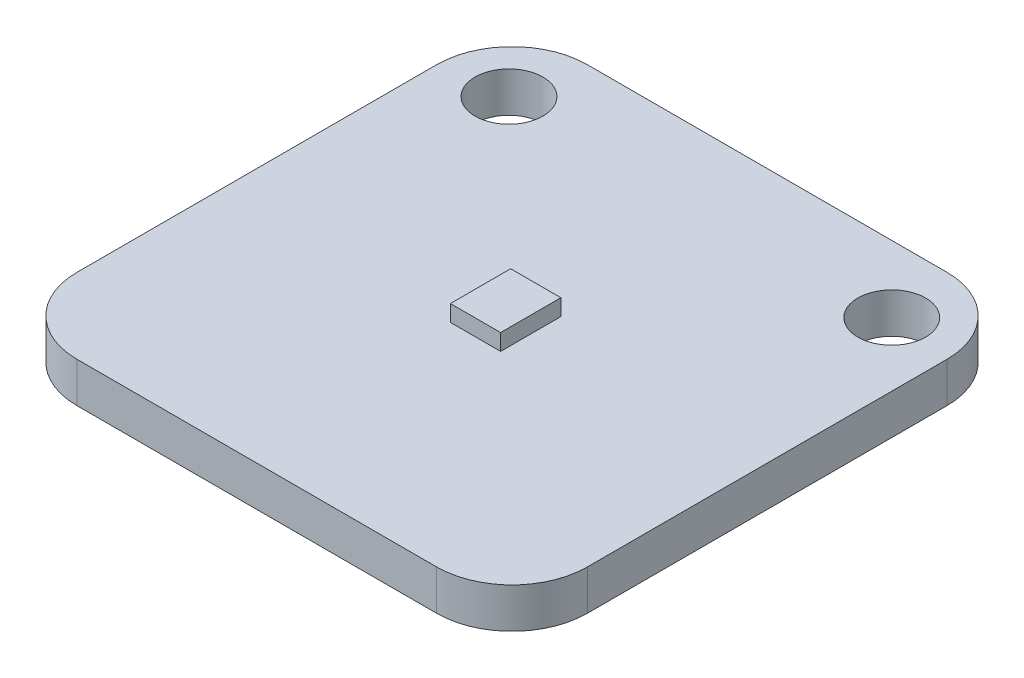
ISO-10303-21;
HEADER;
FILE_DESCRIPTION(('STEP AP214'),'2;1');
FILE_NAME('part.step','',(''),(''),'','','');
FILE_SCHEMA(('AUTOMOTIVE_DESIGN { 1 0 10303 214 1 1 1 1 }'));
ENDSEC;
DATA;
#1=APPLICATION_CONTEXT('core data for automotive mechanical design processes');
#2=APPLICATION_PROTOCOL_DEFINITION('international standard','automotive_design',2000,#1);
#3=PRODUCT_CONTEXT('',#1,'mechanical');
#4=PRODUCT('Part','Part','',(#3));
#5=PRODUCT_RELATED_PRODUCT_CATEGORY('part','',(#4));
#6=PRODUCT_DEFINITION_FORMATION('','',#4);
#7=PRODUCT_DEFINITION_CONTEXT('part definition',#1,'design');
#8=PRODUCT_DEFINITION('design','',#6,#7);
#9=PRODUCT_DEFINITION_SHAPE('','',#8);
#10=(LENGTH_UNIT() NAMED_UNIT(*) SI_UNIT(.MILLI.,.METRE.));
#11=(NAMED_UNIT(*) PLANE_ANGLE_UNIT() SI_UNIT($,.RADIAN.));
#12=(NAMED_UNIT(*) SI_UNIT($,.STERADIAN.) SOLID_ANGLE_UNIT());
#13=UNCERTAINTY_MEASURE_WITH_UNIT(LENGTH_MEASURE(1.E-05),#10,'distance_accuracy_value','');
#14=(GEOMETRIC_REPRESENTATION_CONTEXT(3) GLOBAL_UNCERTAINTY_ASSIGNED_CONTEXT((#13)) GLOBAL_UNIT_ASSIGNED_CONTEXT((#10,
#11,#12)) REPRESENTATION_CONTEXT('',''));
#15=CARTESIAN_POINT('',(0.,0.,0.));
#16=DIRECTION('',(0.,0.,1.));
#17=DIRECTION('',(1.,0.,0.));
#18=AXIS2_PLACEMENT_3D('',#15,#16,#17);
#19=CARTESIAN_POINT('',(0.999999999999998,2.25,-0.945999999999999));
#20=DIRECTION('',(-1.,0.,0.));
#21=DIRECTION('',(0.,0.,1.));
#22=AXIS2_PLACEMENT_3D('',#19,#20,#21);
#23=PLANE('',#22);
#24=DIRECTION('',(0.,0.,-1.));
#25=VECTOR('',#24,1.);
#26=CARTESIAN_POINT('',(0.999999999999998,1.6,-0.945999999999999));
#27=LINE('',#26,#25);
#28=CARTESIAN_POINT('',(0.999999999999999,1.6,1.454));
#29=VERTEX_POINT('',#28);
#30=CARTESIAN_POINT('',(0.999999999999998,1.6,-0.945999999999999));
#31=VERTEX_POINT('',#30);
#32=EDGE_CURVE('E127',#29,#31,#27,.T.);
#33=ORIENTED_EDGE('',*,*,#32,.T.);
#34=DIRECTION('',(0.,-1.,0.));
#35=VECTOR('',#34,1.);
#36=CARTESIAN_POINT('',(0.999999999999998,2.25,-0.945999999999999));
#37=LINE('',#36,#35);
#38=CARTESIAN_POINT('',(0.999999999999998,2.25,-0.945999999999999));
#39=VERTEX_POINT('',#38);
#40=EDGE_CURVE('E12',#39,#31,#37,.T.);
#41=ORIENTED_EDGE('',*,*,#40,.F.);
#42=DIRECTION('',(0.,0.,-1.));
#43=VECTOR('',#42,1.);
#44=CARTESIAN_POINT('',(0.999999999999998,2.25,-0.945999999999999));
#45=LINE('',#44,#43);
#46=CARTESIAN_POINT('',(0.999999999999999,2.25,1.454));
#47=VERTEX_POINT('',#46);
#48=EDGE_CURVE('E108',#47,#39,#45,.T.);
#49=ORIENTED_EDGE('',*,*,#48,.F.);
#50=DIRECTION('',(0.,-1.,0.));
#51=VECTOR('',#50,1.);
#52=CARTESIAN_POINT('',(0.999999999999999,2.25,1.454));
#53=LINE('',#52,#51);
#54=EDGE_CURVE('E125',#47,#29,#53,.T.);
#55=ORIENTED_EDGE('',*,*,#54,.T.);
#56=EDGE_LOOP('',(#33,#41,#49,#55));
#57=FACE_BOUND('',#56,.T.);
#58=ADVANCED_FACE('F60',(#57),#23,.F.);
#59=CARTESIAN_POINT('',(-1.,2.25,-0.945999999999999));
#60=DIRECTION('',(0.,0.,1.));
#61=DIRECTION('',(1.,0.,0.));
#62=AXIS2_PLACEMENT_3D('',#59,#60,#61);
#63=PLANE('',#62);
#64=DIRECTION('',(-1.,0.,0.));
#65=VECTOR('',#64,1.);
#66=CARTESIAN_POINT('',(-1.,1.6,-0.945999999999999));
#67=LINE('',#66,#65);
#68=CARTESIAN_POINT('',(-1.,1.6,-0.945999999999999));
#69=VERTEX_POINT('',#68);
#70=EDGE_CURVE('E111',#31,#69,#67,.T.);
#71=ORIENTED_EDGE('',*,*,#70,.T.);
#72=DIRECTION('',(0.,-1.,0.));
#73=VECTOR('',#72,1.);
#74=CARTESIAN_POINT('',(-1.,2.25,-0.945999999999999));
#75=LINE('',#74,#73);
#76=CARTESIAN_POINT('',(-1.,2.25,-0.945999999999999));
#77=VERTEX_POINT('',#76);
#78=EDGE_CURVE('E67',#77,#69,#75,.T.);
#79=ORIENTED_EDGE('',*,*,#78,.F.);
#80=DIRECTION('',(-1.,0.,0.));
#81=VECTOR('',#80,1.);
#82=CARTESIAN_POINT('',(-1.,2.25,-0.945999999999999));
#83=LINE('',#82,#81);
#84=EDGE_CURVE('E102',#39,#77,#83,.T.);
#85=ORIENTED_EDGE('',*,*,#84,.F.);
#86=ORIENTED_EDGE('',*,*,#40,.T.);
#87=EDGE_LOOP('',(#71,#79,#85,#86));
#88=FACE_BOUND('',#87,.T.);
#89=ADVANCED_FACE('F114',(#88),#63,.F.);
#90=CARTESIAN_POINT('',(-1.,2.25,-0.945999999999999));
#91=DIRECTION('',(1.,0.,0.));
#92=DIRECTION('',(0.,0.,-1.));
#93=AXIS2_PLACEMENT_3D('',#90,#91,#92);
#94=PLANE('',#93);
#95=DIRECTION('',(0.,0.,1.));
#96=VECTOR('',#95,1.);
#97=CARTESIAN_POINT('',(-1.,1.6,-0.945999999999999));
#98=LINE('',#97,#96);
#99=CARTESIAN_POINT('',(-1.,1.6,1.454));
#100=VERTEX_POINT('',#99);
#101=EDGE_CURVE('E93',#69,#100,#98,.T.);
#102=ORIENTED_EDGE('',*,*,#101,.T.);
#103=DIRECTION('',(0.,-1.,0.));
#104=VECTOR('',#103,1.);
#105=CARTESIAN_POINT('',(-1.,2.25,1.454));
#106=LINE('',#105,#104);
#107=CARTESIAN_POINT('',(-1.,2.25,1.454));
#108=VERTEX_POINT('',#107);
#109=EDGE_CURVE('E116',#108,#100,#106,.T.);
#110=ORIENTED_EDGE('',*,*,#109,.F.);
#111=DIRECTION('',(0.,0.,1.));
#112=VECTOR('',#111,1.);
#113=CARTESIAN_POINT('',(-1.,2.25,-0.945999999999999));
#114=LINE('',#113,#112);
#115=EDGE_CURVE('E110',#77,#108,#114,.T.);
#116=ORIENTED_EDGE('',*,*,#115,.F.);
#117=ORIENTED_EDGE('',*,*,#78,.T.);
#118=EDGE_LOOP('',(#102,#110,#116,#117));
#119=FACE_BOUND('',#118,.T.);
#120=ADVANCED_FACE('F120',(#119),#94,.F.);
#121=CARTESIAN_POINT('',(-1.,2.25,1.454));
#122=DIRECTION('',(0.,0.,-1.));
#123=DIRECTION('',(-1.,0.,0.));
#124=AXIS2_PLACEMENT_3D('',#121,#122,#123);
#125=PLANE('',#124);
#126=DIRECTION('',(1.,0.,0.));
#127=VECTOR('',#126,1.);
#128=CARTESIAN_POINT('',(-1.,1.6,1.454));
#129=LINE('',#128,#127);
#130=EDGE_CURVE('E100',#100,#29,#129,.T.);
#131=ORIENTED_EDGE('',*,*,#130,.T.);
#132=ORIENTED_EDGE('',*,*,#54,.F.);
#133=DIRECTION('',(1.,0.,0.));
#134=VECTOR('',#133,1.);
#135=CARTESIAN_POINT('',(-1.,2.25,1.454));
#136=LINE('',#135,#134);
#137=EDGE_CURVE('E74',#108,#47,#136,.T.);
#138=ORIENTED_EDGE('',*,*,#137,.F.);
#139=ORIENTED_EDGE('',*,*,#109,.T.);
#140=EDGE_LOOP('',(#131,#132,#138,#139));
#141=FACE_BOUND('',#140,.T.);
#142=ADVANCED_FACE('F138',(#141),#125,.F.);
#143=CARTESIAN_POINT('',(0.,2.25,0.));
#144=DIRECTION('',(0.,1.,0.));
#145=DIRECTION('',(0.,0.,1.));
#146=AXIS2_PLACEMENT_3D('',#143,#144,#145);
#147=PLANE('',#146);
#148=ORIENTED_EDGE('',*,*,#48,.T.);
#149=ORIENTED_EDGE('',*,*,#84,.T.);
#150=ORIENTED_EDGE('',*,*,#115,.T.);
#151=ORIENTED_EDGE('',*,*,#137,.T.);
#152=EDGE_LOOP('',(#148,#149,#150,#151));
#153=FACE_BOUND('',#152,.T.);
#154=ADVANCED_FACE('F104',(#153),#147,.T.);
#155=CARTESIAN_POINT('',(0.,1.6,0.));
#156=DIRECTION('',(0.,1.,0.));
#157=DIRECTION('',(0.,0.,1.));
#158=AXIS2_PLACEMENT_3D('',#155,#156,#157);
#159=PLANE('',#158);
#160=ORIENTED_EDGE('',*,*,#32,.F.);
#161=ORIENTED_EDGE('',*,*,#130,.F.);
#162=ORIENTED_EDGE('',*,*,#101,.F.);
#163=ORIENTED_EDGE('',*,*,#70,.F.);
#164=EDGE_LOOP('',(#160,#161,#162,#163));
#165=FACE_BOUND('',#164,.T.);
#166=ADVANCED_FACE('F141',(#165),#159,.F.);
#167=CLOSED_SHELL('',(#58,#89,#120,#142,#154,#166));
#168=MANIFOLD_SOLID_BREP('B2',#167);
#169=CARTESIAN_POINT('',(-7.16,1.6,7.16));
#170=DIRECTION('',(0.,-1.,0.));
#171=DIRECTION('',(0.,0.,-1.));
#172=AXIS2_PLACEMENT_3D('',#169,#170,#171);
#173=CYLINDRICAL_SURFACE('',#172,3.);
#174=CARTESIAN_POINT('',(-7.16,0.,7.16));
#175=DIRECTION('',(0.,1.,0.));
#176=DIRECTION('',(0.,0.,1.));
#177=AXIS2_PLACEMENT_3D('',#174,#175,#176);
#178=CIRCLE('',#177,3.);
#179=CARTESIAN_POINT('',(-10.16,0.,7.16));
#180=VERTEX_POINT('',#179);
#181=CARTESIAN_POINT('',(-7.16,0.,10.16));
#182=VERTEX_POINT('',#181);
#183=EDGE_CURVE('E332',#180,#182,#178,.T.);
#184=ORIENTED_EDGE('',*,*,#183,.T.);
#185=DIRECTION('',(0.,-1.,0.));
#186=VECTOR('',#185,1.);
#187=CARTESIAN_POINT('',(-7.16,1.6,10.16));
#188=LINE('',#187,#186);
#189=CARTESIAN_POINT('',(-7.16,1.6,10.16));
#190=VERTEX_POINT('',#189);
#191=EDGE_CURVE('E54',#190,#182,#188,.T.);
#192=ORIENTED_EDGE('',*,*,#191,.F.);
#193=CARTESIAN_POINT('',(-7.16,1.6,7.16));
#194=DIRECTION('',(0.,1.,0.));
#195=DIRECTION('',(0.,0.,1.));
#196=AXIS2_PLACEMENT_3D('',#193,#194,#195);
#197=CIRCLE('',#196,3.);
#198=CARTESIAN_POINT('',(-10.16,1.6,7.16));
#199=VERTEX_POINT('',#198);
#200=EDGE_CURVE('E353',#199,#190,#197,.T.);
#201=ORIENTED_EDGE('',*,*,#200,.F.);
#202=DIRECTION('',(0.,-1.,0.));
#203=VECTOR('',#202,1.);
#204=CARTESIAN_POINT('',(-10.16,1.6,7.16));
#205=LINE('',#204,#203);
#206=EDGE_CURVE('E330',#199,#180,#205,.T.);
#207=ORIENTED_EDGE('',*,*,#206,.T.);
#208=EDGE_LOOP('',(#184,#192,#201,#207));
#209=FACE_BOUND('',#208,.T.);
#210=ADVANCED_FACE('F228',(#209),#173,.T.);
#211=CARTESIAN_POINT('',(-7.16,1.6,10.16));
#212=DIRECTION('',(0.,0.,-1.));
#213=DIRECTION('',(-1.,0.,0.));
#214=AXIS2_PLACEMENT_3D('',#211,#212,#213);
#215=PLANE('',#214);
#216=DIRECTION('',(1.,0.,0.));
#217=VECTOR('',#216,1.);
#218=CARTESIAN_POINT('',(-7.16,0.,10.16));
#219=LINE('',#218,#217);
#220=CARTESIAN_POINT('',(7.16,0.,10.16));
#221=VERTEX_POINT('',#220);
#222=EDGE_CURVE('E333',#182,#221,#219,.T.);
#223=ORIENTED_EDGE('',*,*,#222,.T.);
#224=DIRECTION('',(0.,-1.,0.));
#225=VECTOR('',#224,1.);
#226=CARTESIAN_POINT('',(7.16,1.6,10.16));
#227=LINE('',#226,#225);
#228=CARTESIAN_POINT('',(7.16,1.6,10.16));
#229=VERTEX_POINT('',#228);
#230=EDGE_CURVE('E236',#229,#221,#227,.T.);
#231=ORIENTED_EDGE('',*,*,#230,.F.);
#232=DIRECTION('',(1.,0.,0.));
#233=VECTOR('',#232,1.);
#234=CARTESIAN_POINT('',(-7.16,1.6,10.16));
#235=LINE('',#234,#233);
#236=EDGE_CURVE('E286',#190,#229,#235,.T.);
#237=ORIENTED_EDGE('',*,*,#236,.F.);
#238=ORIENTED_EDGE('',*,*,#191,.T.);
#239=EDGE_LOOP('',(#223,#231,#237,#238));
#240=FACE_BOUND('',#239,.T.);
#241=ADVANCED_FACE('F438',(#240),#215,.F.);
#242=CARTESIAN_POINT('',(7.16,1.6,7.16));
#243=DIRECTION('',(0.,-1.,0.));
#244=DIRECTION('',(0.,0.,-1.));
#245=AXIS2_PLACEMENT_3D('',#242,#243,#244);
#246=CYLINDRICAL_SURFACE('',#245,3.);
#247=CARTESIAN_POINT('',(7.16,0.,7.16));
#248=DIRECTION('',(0.,1.,0.));
#249=DIRECTION('',(0.,0.,1.));
#250=AXIS2_PLACEMENT_3D('',#247,#248,#249);
#251=CIRCLE('',#250,3.);
#252=CARTESIAN_POINT('',(10.16,0.,7.16));
#253=VERTEX_POINT('',#252);
#254=EDGE_CURVE('E338',#221,#253,#251,.T.);
#255=ORIENTED_EDGE('',*,*,#254,.T.);
#256=DIRECTION('',(0.,-1.,0.));
#257=VECTOR('',#256,1.);
#258=CARTESIAN_POINT('',(10.16,1.6,7.16));
#259=LINE('',#258,#257);
#260=CARTESIAN_POINT('',(10.16,1.6,7.16));
#261=VERTEX_POINT('',#260);
#262=EDGE_CURVE('E364',#261,#253,#259,.T.);
#263=ORIENTED_EDGE('',*,*,#262,.F.);
#264=CARTESIAN_POINT('',(7.16,1.6,7.16));
#265=DIRECTION('',(0.,1.,0.));
#266=DIRECTION('',(0.,0.,1.));
#267=AXIS2_PLACEMENT_3D('',#264,#265,#266);
#268=CIRCLE('',#267,3.);
#269=EDGE_CURVE('E376',#229,#261,#268,.T.);
#270=ORIENTED_EDGE('',*,*,#269,.F.);
#271=ORIENTED_EDGE('',*,*,#230,.T.);
#272=EDGE_LOOP('',(#255,#263,#270,#271));
#273=FACE_BOUND('',#272,.T.);
#274=ADVANCED_FACE('F372',(#273),#246,.T.);
#275=CARTESIAN_POINT('',(10.16,1.6,-7.16));
#276=DIRECTION('',(-1.,0.,0.));
#277=DIRECTION('',(0.,0.,1.));
#278=AXIS2_PLACEMENT_3D('',#275,#276,#277);
#279=PLANE('',#278);
#280=DIRECTION('',(0.,0.,-1.));
#281=VECTOR('',#280,1.);
#282=CARTESIAN_POINT('',(10.16,0.,-7.16));
#283=LINE('',#282,#281);
#284=CARTESIAN_POINT('',(10.16,0.,-7.16));
#285=VERTEX_POINT('',#284);
#286=EDGE_CURVE('E345',#253,#285,#283,.T.);
#287=ORIENTED_EDGE('',*,*,#286,.T.);
#288=DIRECTION('',(0.,-1.,0.));
#289=VECTOR('',#288,1.);
#290=CARTESIAN_POINT('',(10.16,1.6,-7.16));
#291=LINE('',#290,#289);
#292=CARTESIAN_POINT('',(10.16,1.6,-7.16));
#293=VERTEX_POINT('',#292);
#294=EDGE_CURVE('E363',#293,#285,#291,.T.);
#295=ORIENTED_EDGE('',*,*,#294,.F.);
#296=DIRECTION('',(0.,0.,-1.));
#297=VECTOR('',#296,1.);
#298=CARTESIAN_POINT('',(10.16,1.6,-7.16));
#299=LINE('',#298,#297);
#300=EDGE_CURVE('E386',#261,#293,#299,.T.);
#301=ORIENTED_EDGE('',*,*,#300,.F.);
#302=ORIENTED_EDGE('',*,*,#262,.T.);
#303=EDGE_LOOP('',(#287,#295,#301,#302));
#304=FACE_BOUND('',#303,.T.);
#305=ADVANCED_FACE('F383',(#304),#279,.F.);
#306=CARTESIAN_POINT('',(7.16,1.6,-7.16));
#307=DIRECTION('',(0.,-1.,0.));
#308=DIRECTION('',(0.,0.,-1.));
#309=AXIS2_PLACEMENT_3D('',#306,#307,#308);
#310=CYLINDRICAL_SURFACE('',#309,3.);
#311=CARTESIAN_POINT('',(7.16,0.,-7.16));
#312=DIRECTION('',(0.,1.,0.));
#313=DIRECTION('',(0.,0.,1.));
#314=AXIS2_PLACEMENT_3D('',#311,#312,#313);
#315=CIRCLE('',#314,3.);
#316=CARTESIAN_POINT('',(7.16,0.,-10.16));
#317=VERTEX_POINT('',#316);
#318=EDGE_CURVE('E343',#285,#317,#315,.T.);
#319=ORIENTED_EDGE('',*,*,#318,.T.);
#320=DIRECTION('',(0.,-1.,0.));
#321=VECTOR('',#320,1.);
#322=CARTESIAN_POINT('',(7.16,1.6,-10.16));
#323=LINE('',#322,#321);
#324=CARTESIAN_POINT('',(7.16,1.6,-10.16));
#325=VERTEX_POINT('',#324);
#326=EDGE_CURVE('E317',#325,#317,#323,.T.);
#327=ORIENTED_EDGE('',*,*,#326,.F.);
#328=CARTESIAN_POINT('',(7.16,1.6,-7.16));
#329=DIRECTION('',(0.,1.,0.));
#330=DIRECTION('',(0.,0.,1.));
#331=AXIS2_PLACEMENT_3D('',#328,#329,#330);
#332=CIRCLE('',#331,3.);
#333=EDGE_CURVE('E306',#293,#325,#332,.T.);
#334=ORIENTED_EDGE('',*,*,#333,.F.);
#335=ORIENTED_EDGE('',*,*,#294,.T.);
#336=EDGE_LOOP('',(#319,#327,#334,#335));
#337=FACE_BOUND('',#336,.T.);
#338=ADVANCED_FACE('F390',(#337),#310,.T.);
#339=CARTESIAN_POINT('',(-7.16,1.6,-10.16));
#340=DIRECTION('',(0.,0.,1.));
#341=DIRECTION('',(1.,0.,0.));
#342=AXIS2_PLACEMENT_3D('',#339,#340,#341);
#343=PLANE('',#342);
#344=DIRECTION('',(-1.,0.,0.));
#345=VECTOR('',#344,1.);
#346=CARTESIAN_POINT('',(-7.16,0.,-10.16));
#347=LINE('',#346,#345);
#348=CARTESIAN_POINT('',(-7.16,0.,-10.16));
#349=VERTEX_POINT('',#348);
#350=EDGE_CURVE('E320',#317,#349,#347,.T.);
#351=ORIENTED_EDGE('',*,*,#350,.T.);
#352=DIRECTION('',(0.,-1.,0.));
#353=VECTOR('',#352,1.);
#354=CARTESIAN_POINT('',(-7.16,1.6,-10.16));
#355=LINE('',#354,#353);
#356=CARTESIAN_POINT('',(-7.16,1.6,-10.16));
#357=VERTEX_POINT('',#356);
#358=EDGE_CURVE('E314',#357,#349,#355,.T.);
#359=ORIENTED_EDGE('',*,*,#358,.F.);
#360=DIRECTION('',(-1.,0.,0.));
#361=VECTOR('',#360,1.);
#362=CARTESIAN_POINT('',(-7.16,1.6,-10.16));
#363=LINE('',#362,#361);
#364=EDGE_CURVE('E305',#325,#357,#363,.T.);
#365=ORIENTED_EDGE('',*,*,#364,.F.);
#366=ORIENTED_EDGE('',*,*,#326,.T.);
#367=EDGE_LOOP('',(#351,#359,#365,#366));
#368=FACE_BOUND('',#367,.T.);
#369=ADVANCED_FACE('F312',(#368),#343,.F.);
#370=CARTESIAN_POINT('',(-7.16,1.6,-7.16));
#371=DIRECTION('',(0.,-1.,0.));
#372=DIRECTION('',(0.,0.,-1.));
#373=AXIS2_PLACEMENT_3D('',#370,#371,#372);
#374=CYLINDRICAL_SURFACE('',#373,3.);
#375=CARTESIAN_POINT('',(-7.16,0.,-7.16));
#376=DIRECTION('',(0.,1.,0.));
#377=DIRECTION('',(0.,0.,1.));
#378=AXIS2_PLACEMENT_3D('',#375,#376,#377);
#379=CIRCLE('',#378,3.);
#380=CARTESIAN_POINT('',(-10.16,0.,-7.16));
#381=VERTEX_POINT('',#380);
#382=EDGE_CURVE('E274',#349,#381,#379,.T.);
#383=ORIENTED_EDGE('',*,*,#382,.T.);
#384=DIRECTION('',(0.,-1.,0.));
#385=VECTOR('',#384,1.);
#386=CARTESIAN_POINT('',(-10.16,1.6,-7.16));
#387=LINE('',#386,#385);
#388=CARTESIAN_POINT('',(-10.16,1.6,-7.16));
#389=VERTEX_POINT('',#388);
#390=EDGE_CURVE('E319',#389,#381,#387,.T.);
#391=ORIENTED_EDGE('',*,*,#390,.F.);
#392=CARTESIAN_POINT('',(-7.16,1.6,-7.16));
#393=DIRECTION('',(0.,1.,0.));
#394=DIRECTION('',(0.,0.,1.));
#395=AXIS2_PLACEMENT_3D('',#392,#393,#394);
#396=CIRCLE('',#395,3.);
#397=EDGE_CURVE('E308',#357,#389,#396,.T.);
#398=ORIENTED_EDGE('',*,*,#397,.F.);
#399=ORIENTED_EDGE('',*,*,#358,.T.);
#400=EDGE_LOOP('',(#383,#391,#398,#399));
#401=FACE_BOUND('',#400,.T.);
#402=ADVANCED_FACE('F325',(#401),#374,.T.);
#403=CARTESIAN_POINT('',(-10.16,1.6,-7.16));
#404=DIRECTION('',(1.,0.,0.));
#405=DIRECTION('',(0.,0.,-1.));
#406=AXIS2_PLACEMENT_3D('',#403,#404,#405);
#407=PLANE('',#406);
#408=DIRECTION('',(0.,0.,1.));
#409=VECTOR('',#408,1.);
#410=CARTESIAN_POINT('',(-10.16,0.,-7.16));
#411=LINE('',#410,#409);
#412=EDGE_CURVE('E281',#381,#180,#411,.T.);
#413=ORIENTED_EDGE('',*,*,#412,.T.);
#414=ORIENTED_EDGE('',*,*,#206,.F.);
#415=DIRECTION('',(0.,0.,1.));
#416=VECTOR('',#415,1.);
#417=CARTESIAN_POINT('',(-10.16,1.6,-7.16));
#418=LINE('',#417,#416);
#419=EDGE_CURVE('E247',#389,#199,#418,.T.);
#420=ORIENTED_EDGE('',*,*,#419,.F.);
#421=ORIENTED_EDGE('',*,*,#390,.T.);
#422=EDGE_LOOP('',(#413,#414,#420,#421));
#423=FACE_BOUND('',#422,.T.);
#424=ADVANCED_FACE('F425',(#423),#407,.F.);
#425=CARTESIAN_POINT('',(-7.16,1.6,7.16));
#426=DIRECTION('',(0.,1.,0.));
#427=DIRECTION('',(0.,0.,1.));
#428=AXIS2_PLACEMENT_3D('',#425,#426,#427);
#429=PLANE('',#428);
#430=CARTESIAN_POINT('',(-7.62,1.6,-7.5));
#431=DIRECTION('',(0.,1.,0.));
#432=DIRECTION('',(0.,0.,1.));
#433=AXIS2_PLACEMENT_3D('',#430,#431,#432);
#434=CIRCLE('',#433,1.35);
#435=CARTESIAN_POINT('',(-7.62,1.6,-6.15));
#436=VERTEX_POINT('',#435);
#437=EDGE_CURVE('E336',#436,#436,#434,.T.);
#438=ORIENTED_EDGE('',*,*,#437,.F.);
#439=EDGE_LOOP('',(#438));
#440=FACE_BOUND('',#439,.T.);
#441=CARTESIAN_POINT('',(7.62,1.6,-7.5));
#442=DIRECTION('',(0.,1.,0.));
#443=DIRECTION('',(0.,0.,-1.));
#444=AXIS2_PLACEMENT_3D('',#441,#442,#443);
#445=CIRCLE('',#444,1.35);
#446=CARTESIAN_POINT('',(7.62,1.6,-8.85));
#447=VERTEX_POINT('',#446);
#448=EDGE_CURVE('E398',#447,#447,#445,.T.);
#449=ORIENTED_EDGE('',*,*,#448,.F.);
#450=EDGE_LOOP('',(#449));
#451=FACE_BOUND('',#450,.T.);
#452=ORIENTED_EDGE('',*,*,#200,.T.);
#453=ORIENTED_EDGE('',*,*,#236,.T.);
#454=ORIENTED_EDGE('',*,*,#269,.T.);
#455=ORIENTED_EDGE('',*,*,#300,.T.);
#456=ORIENTED_EDGE('',*,*,#333,.T.);
#457=ORIENTED_EDGE('',*,*,#364,.T.);
#458=ORIENTED_EDGE('',*,*,#397,.T.);
#459=ORIENTED_EDGE('',*,*,#419,.T.);
#460=EDGE_LOOP('',(#452,#453,#454,#455,#456,#457,#458,#459));
#461=FACE_BOUND('',#460,.T.);
#462=ADVANCED_FACE('F301',(#440,#451,#461),#429,.T.);
#463=CARTESIAN_POINT('',(-7.16,0.,7.16));
#464=DIRECTION('',(0.,1.,0.));
#465=DIRECTION('',(0.,0.,1.));
#466=AXIS2_PLACEMENT_3D('',#463,#464,#465);
#467=PLANE('',#466);
#468=CARTESIAN_POINT('',(-7.62,0.,-7.5));
#469=DIRECTION('',(0.,1.,0.));
#470=DIRECTION('',(0.,0.,1.));
#471=AXIS2_PLACEMENT_3D('',#468,#469,#470);
#472=CIRCLE('',#471,1.35);
#473=CARTESIAN_POINT('',(-7.62,0.,-6.15));
#474=VERTEX_POINT('',#473);
#475=EDGE_CURVE('E407',#474,#474,#472,.T.);
#476=ORIENTED_EDGE('',*,*,#475,.T.);
#477=EDGE_LOOP('',(#476));
#478=FACE_BOUND('',#477,.T.);
#479=CARTESIAN_POINT('',(7.62,0.,-7.5));
#480=DIRECTION('',(0.,1.,0.));
#481=DIRECTION('',(0.,0.,-1.));
#482=AXIS2_PLACEMENT_3D('',#479,#480,#481);
#483=CIRCLE('',#482,1.35);
#484=CARTESIAN_POINT('',(7.62,0.,-8.85));
#485=VERTEX_POINT('',#484);
#486=EDGE_CURVE('E404',#485,#485,#483,.T.);
#487=ORIENTED_EDGE('',*,*,#486,.T.);
#488=EDGE_LOOP('',(#487));
#489=FACE_BOUND('',#488,.T.);
#490=ORIENTED_EDGE('',*,*,#183,.F.);
#491=ORIENTED_EDGE('',*,*,#412,.F.);
#492=ORIENTED_EDGE('',*,*,#382,.F.);
#493=ORIENTED_EDGE('',*,*,#350,.F.);
#494=ORIENTED_EDGE('',*,*,#318,.F.);
#495=ORIENTED_EDGE('',*,*,#286,.F.);
#496=ORIENTED_EDGE('',*,*,#254,.F.);
#497=ORIENTED_EDGE('',*,*,#222,.F.);
#498=EDGE_LOOP('',(#490,#491,#492,#493,#494,#495,#496,#497));
#499=FACE_BOUND('',#498,.T.);
#500=ADVANCED_FACE('F379',(#478,#489,#499),#467,.F.);
#501=CARTESIAN_POINT('',(7.62,1.6,-7.5));
#502=DIRECTION('',(0.,-1.,0.));
#503=DIRECTION('',(0.,0.,-1.));
#504=AXIS2_PLACEMENT_3D('',#501,#502,#503);
#505=CYLINDRICAL_SURFACE('',#504,1.35);
#506=ORIENTED_EDGE('',*,*,#448,.T.);
#507=EDGE_LOOP('',(#506));
#508=FACE_BOUND('',#507,.T.);
#509=ORIENTED_EDGE('',*,*,#486,.F.);
#510=EDGE_LOOP('',(#509));
#511=FACE_BOUND('',#510,.T.);
#512=ADVANCED_FACE('F426',(#508,#511),#505,.F.);
#513=CARTESIAN_POINT('',(-7.62,1.6,-7.5));
#514=DIRECTION('',(0.,-1.,0.));
#515=DIRECTION('',(0.,0.,-1.));
#516=AXIS2_PLACEMENT_3D('',#513,#514,#515);
#517=CYLINDRICAL_SURFACE('',#516,1.35);
#518=ORIENTED_EDGE('',*,*,#437,.T.);
#519=EDGE_LOOP('',(#518));
#520=FACE_BOUND('',#519,.T.);
#521=ORIENTED_EDGE('',*,*,#475,.F.);
#522=EDGE_LOOP('',(#521));
#523=FACE_BOUND('',#522,.T.);
#524=ADVANCED_FACE('F417',(#520,#523),#517,.F.);
#525=CLOSED_SHELL('',(#210,#241,#274,#305,#338,#369,#402,#424,#462,#500,#512,#524));
#526=MANIFOLD_SOLID_BREP('B6',#525);
#527=ADVANCED_BREP_SHAPE_REPRESENTATION('',(#18,#168,#526),#14);
#528=SHAPE_DEFINITION_REPRESENTATION(#9,#527);
ENDSEC;
END-ISO-10303-21;
